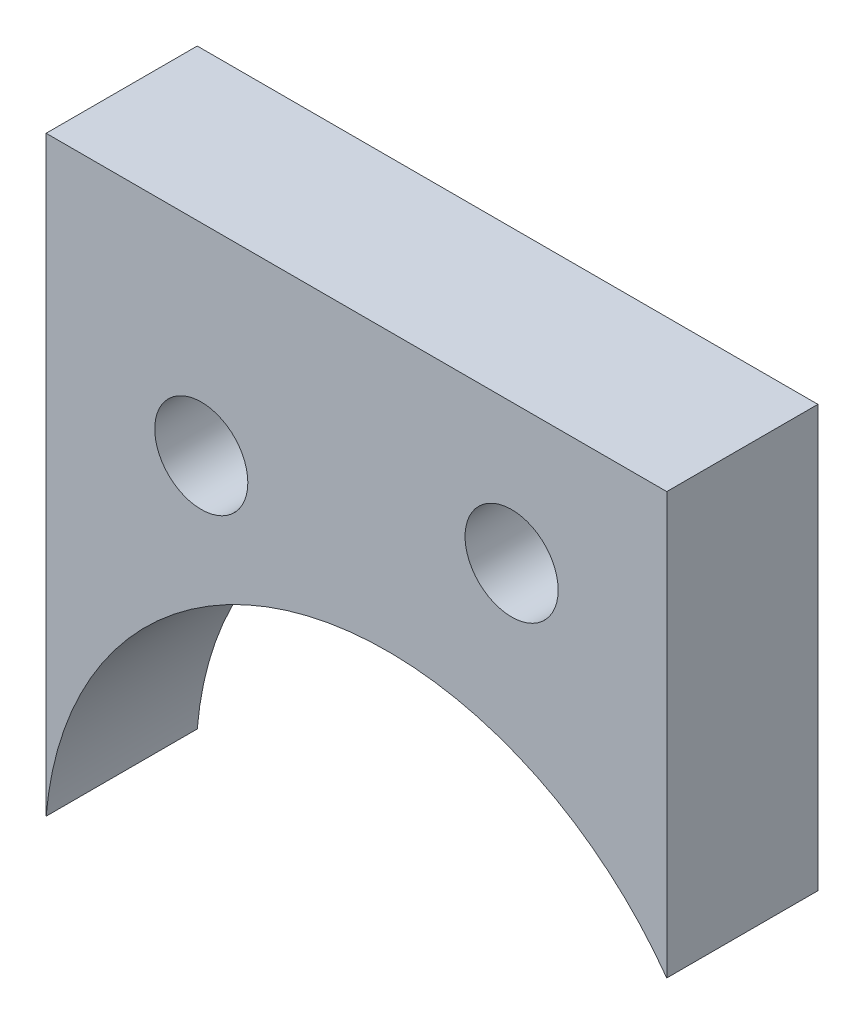
ISO-10303-21;
HEADER;
FILE_DESCRIPTION(('STEP AP214'),'2;1');
FILE_NAME('part.step','',(''),(''),'','','');
FILE_SCHEMA(('AUTOMOTIVE_DESIGN { 1 0 10303 214 1 1 1 1 }'));
ENDSEC;
DATA;
#1=APPLICATION_CONTEXT('core data for automotive mechanical design processes');
#2=APPLICATION_PROTOCOL_DEFINITION('international standard','automotive_design',2000,#1);
#3=PRODUCT_CONTEXT('',#1,'mechanical');
#4=PRODUCT('Part','Part','',(#3));
#5=PRODUCT_RELATED_PRODUCT_CATEGORY('part','',(#4));
#6=PRODUCT_DEFINITION_FORMATION('','',#4);
#7=PRODUCT_DEFINITION_CONTEXT('part definition',#1,'design');
#8=PRODUCT_DEFINITION('design','',#6,#7);
#9=PRODUCT_DEFINITION_SHAPE('','',#8);
#10=(LENGTH_UNIT() NAMED_UNIT(*) SI_UNIT(.MILLI.,.METRE.));
#11=(NAMED_UNIT(*) PLANE_ANGLE_UNIT() SI_UNIT($,.RADIAN.));
#12=(NAMED_UNIT(*) SI_UNIT($,.STERADIAN.) SOLID_ANGLE_UNIT());
#13=UNCERTAINTY_MEASURE_WITH_UNIT(LENGTH_MEASURE(1.E-05),#10,'distance_accuracy_value','');
#14=(GEOMETRIC_REPRESENTATION_CONTEXT(3) GLOBAL_UNCERTAINTY_ASSIGNED_CONTEXT((#13)) GLOBAL_UNIT_ASSIGNED_CONTEXT((#10,
#11,#12)) REPRESENTATION_CONTEXT('',''));
#15=CARTESIAN_POINT('',(0.,0.,0.));
#16=DIRECTION('',(0.,0.,1.));
#17=DIRECTION('',(1.,0.,0.));
#18=AXIS2_PLACEMENT_3D('',#15,#16,#17);
#19=CARTESIAN_POINT('',(11.01,0.,4.87));
#20=DIRECTION('',(0.,0.,1.));
#21=DIRECTION('',(1.,0.,0.));
#22=AXIS2_PLACEMENT_3D('',#19,#20,#21);
#23=PLANE('',#22);
#24=CARTESIAN_POINT('',(5.,13.5,4.87));
#25=DIRECTION('',(0.,0.,1.));
#26=DIRECTION('',(1.,0.,0.));
#27=AXIS2_PLACEMENT_3D('',#24,#25,#26);
#28=CIRCLE('',#27,1.5);
#29=CARTESIAN_POINT('',(6.5,13.5,4.87));
#30=VERTEX_POINT('',#29);
#31=EDGE_CURVE('E116',#30,#30,#28,.T.);
#32=ORIENTED_EDGE('',*,*,#31,.F.);
#33=EDGE_LOOP('',(#32));
#34=FACE_BOUND('',#33,.T.);
#35=DIRECTION('',(0.,1.,0.));
#36=VECTOR('',#35,1.);
#37=CARTESIAN_POINT('',(20.,6.42513813081089,4.87));
#38=LINE('',#37,#36);
#39=CARTESIAN_POINT('',(20.,6.42513813081089,4.87));
#40=VERTEX_POINT('',#39);
#41=CARTESIAN_POINT('',(20.,20.,4.87));
#42=VERTEX_POINT('',#41);
#43=EDGE_CURVE('E96',#40,#42,#38,.T.);
#44=ORIENTED_EDGE('',*,*,#43,.T.);
#45=DIRECTION('',(-1.,0.,0.));
#46=VECTOR('',#45,1.);
#47=CARTESIAN_POINT('',(0.,20.,4.87));
#48=LINE('',#47,#46);
#49=CARTESIAN_POINT('',(0.,20.,4.87));
#50=VERTEX_POINT('',#49);
#51=EDGE_CURVE('E91',#42,#50,#48,.T.);
#52=ORIENTED_EDGE('',*,*,#51,.T.);
#53=DIRECTION('',(0.,-1.,0.));
#54=VECTOR('',#53,1.);
#55=CARTESIAN_POINT('',(0.,0.939361485265461,4.87));
#56=LINE('',#55,#54);
#57=CARTESIAN_POINT('',(0.,0.939361485265461,4.87));
#58=VERTEX_POINT('',#57);
#59=EDGE_CURVE('E94',#50,#58,#56,.T.);
#60=ORIENTED_EDGE('',*,*,#59,.T.);
#61=CARTESIAN_POINT('',(11.01,0.,4.87));
#62=DIRECTION('',(0.,0.,-1.));
#63=DIRECTION('',(1.,0.,0.));
#64=AXIS2_PLACEMENT_3D('',#61,#62,#63);
#65=CIRCLE('',#64,11.05);
#66=EDGE_CURVE('E61',#58,#40,#65,.T.);
#67=ORIENTED_EDGE('',*,*,#66,.T.);
#68=EDGE_LOOP('',(#44,#52,#60,#67));
#69=FACE_BOUND('',#68,.T.);
#70=CARTESIAN_POINT('',(15.,15.5,4.87));
#71=DIRECTION('',(0.,0.,1.));
#72=DIRECTION('',(1.,0.,0.));
#73=AXIS2_PLACEMENT_3D('',#70,#71,#72);
#74=CIRCLE('',#73,1.5);
#75=CARTESIAN_POINT('',(16.5,15.5,4.87));
#76=VERTEX_POINT('',#75);
#77=EDGE_CURVE('E138',#76,#76,#74,.T.);
#78=ORIENTED_EDGE('',*,*,#77,.F.);
#79=EDGE_LOOP('',(#78));
#80=FACE_BOUND('',#79,.T.);
#81=ADVANCED_FACE('F43',(#34,#69,#80),#23,.T.);
#82=CARTESIAN_POINT('',(11.01,0.,0.));
#83=DIRECTION('',(0.,0.,1.));
#84=DIRECTION('',(1.,0.,0.));
#85=AXIS2_PLACEMENT_3D('',#82,#83,#84);
#86=PLANE('',#85);
#87=DIRECTION('',(0.,1.,0.));
#88=VECTOR('',#87,1.);
#89=CARTESIAN_POINT('',(20.,6.42513813081089,0.));
#90=LINE('',#89,#88);
#91=CARTESIAN_POINT('',(20.,6.42513813081089,0.));
#92=VERTEX_POINT('',#91);
#93=CARTESIAN_POINT('',(20.,20.,0.));
#94=VERTEX_POINT('',#93);
#95=EDGE_CURVE('E112',#92,#94,#90,.T.);
#96=ORIENTED_EDGE('',*,*,#95,.F.);
#97=CARTESIAN_POINT('',(11.01,0.,0.));
#98=DIRECTION('',(0.,0.,-1.));
#99=DIRECTION('',(1.,0.,0.));
#100=AXIS2_PLACEMENT_3D('',#97,#98,#99);
#101=CIRCLE('',#100,11.05);
#102=CARTESIAN_POINT('',(0.,0.939361485265461,0.));
#103=VERTEX_POINT('',#102);
#104=EDGE_CURVE('E84',#103,#92,#101,.T.);
#105=ORIENTED_EDGE('',*,*,#104,.F.);
#106=DIRECTION('',(0.,-1.,0.));
#107=VECTOR('',#106,1.);
#108=CARTESIAN_POINT('',(0.,0.939361485265461,0.));
#109=LINE('',#108,#107);
#110=CARTESIAN_POINT('',(0.,20.,0.));
#111=VERTEX_POINT('',#110);
#112=EDGE_CURVE('E78',#111,#103,#109,.T.);
#113=ORIENTED_EDGE('',*,*,#112,.F.);
#114=DIRECTION('',(-1.,0.,0.));
#115=VECTOR('',#114,1.);
#116=CARTESIAN_POINT('',(0.,20.,0.));
#117=LINE('',#116,#115);
#118=EDGE_CURVE('E101',#94,#111,#117,.T.);
#119=ORIENTED_EDGE('',*,*,#118,.F.);
#120=EDGE_LOOP('',(#96,#105,#113,#119));
#121=FACE_BOUND('',#120,.T.);
#122=CARTESIAN_POINT('',(5.,13.5,0.));
#123=DIRECTION('',(0.,0.,1.));
#124=DIRECTION('',(1.,0.,0.));
#125=AXIS2_PLACEMENT_3D('',#122,#123,#124);
#126=CIRCLE('',#125,1.5);
#127=CARTESIAN_POINT('',(6.5,13.5,0.));
#128=VERTEX_POINT('',#127);
#129=EDGE_CURVE('E134',#128,#128,#126,.T.);
#130=ORIENTED_EDGE('',*,*,#129,.T.);
#131=EDGE_LOOP('',(#130));
#132=FACE_BOUND('',#131,.T.);
#133=CARTESIAN_POINT('',(15.,15.5,0.));
#134=DIRECTION('',(0.,0.,1.));
#135=DIRECTION('',(1.,0.,0.));
#136=AXIS2_PLACEMENT_3D('',#133,#134,#135);
#137=CIRCLE('',#136,1.5);
#138=CARTESIAN_POINT('',(16.5,15.5,0.));
#139=VERTEX_POINT('',#138);
#140=EDGE_CURVE('E142',#139,#139,#137,.T.);
#141=ORIENTED_EDGE('',*,*,#140,.T.);
#142=EDGE_LOOP('',(#141));
#143=FACE_BOUND('',#142,.T.);
#144=ADVANCED_FACE('F129',(#121,#132,#143),#86,.F.);
#145=CARTESIAN_POINT('',(20.,6.42513813081089,4.87));
#146=DIRECTION('',(-1.,0.,0.));
#147=DIRECTION('',(0.,0.,1.));
#148=AXIS2_PLACEMENT_3D('',#145,#146,#147);
#149=PLANE('',#148);
#150=ORIENTED_EDGE('',*,*,#95,.T.);
#151=DIRECTION('',(0.,0.,-1.));
#152=VECTOR('',#151,1.);
#153=CARTESIAN_POINT('',(20.,20.,4.87));
#154=LINE('',#153,#152);
#155=EDGE_CURVE('E11',#42,#94,#154,.T.);
#156=ORIENTED_EDGE('',*,*,#155,.F.);
#157=ORIENTED_EDGE('',*,*,#43,.F.);
#158=DIRECTION('',(0.,0.,-1.));
#159=VECTOR('',#158,1.);
#160=CARTESIAN_POINT('',(20.,6.42513813081089,4.87));
#161=LINE('',#160,#159);
#162=EDGE_CURVE('E108',#40,#92,#161,.T.);
#163=ORIENTED_EDGE('',*,*,#162,.T.);
#164=EDGE_LOOP('',(#150,#156,#157,#163));
#165=FACE_BOUND('',#164,.T.);
#166=ADVANCED_FACE('F45',(#165),#149,.F.);
#167=CARTESIAN_POINT('',(0.,20.,4.87));
#168=DIRECTION('',(0.,-1.,0.));
#169=DIRECTION('',(0.,0.,-1.));
#170=AXIS2_PLACEMENT_3D('',#167,#168,#169);
#171=PLANE('',#170);
#172=ORIENTED_EDGE('',*,*,#118,.T.);
#173=DIRECTION('',(0.,0.,-1.));
#174=VECTOR('',#173,1.);
#175=CARTESIAN_POINT('',(0.,20.,4.87));
#176=LINE('',#175,#174);
#177=EDGE_CURVE('E53',#50,#111,#176,.T.);
#178=ORIENTED_EDGE('',*,*,#177,.F.);
#179=ORIENTED_EDGE('',*,*,#51,.F.);
#180=ORIENTED_EDGE('',*,*,#155,.T.);
#181=EDGE_LOOP('',(#172,#178,#179,#180));
#182=FACE_BOUND('',#181,.T.);
#183=ADVANCED_FACE('F100',(#182),#171,.F.);
#184=CARTESIAN_POINT('',(0.,0.939361485265461,4.87));
#185=DIRECTION('',(1.,0.,0.));
#186=DIRECTION('',(0.,0.,-1.));
#187=AXIS2_PLACEMENT_3D('',#184,#185,#186);
#188=PLANE('',#187);
#189=ORIENTED_EDGE('',*,*,#112,.T.);
#190=DIRECTION('',(0.,0.,-1.));
#191=VECTOR('',#190,1.);
#192=CARTESIAN_POINT('',(0.,0.939361485265461,4.87));
#193=LINE('',#192,#191);
#194=EDGE_CURVE('E103',#58,#103,#193,.T.);
#195=ORIENTED_EDGE('',*,*,#194,.F.);
#196=ORIENTED_EDGE('',*,*,#59,.F.);
#197=ORIENTED_EDGE('',*,*,#177,.T.);
#198=EDGE_LOOP('',(#189,#195,#196,#197));
#199=FACE_BOUND('',#198,.T.);
#200=ADVANCED_FACE('F104',(#199),#188,.F.);
#201=CARTESIAN_POINT('',(11.01,0.,4.87));
#202=DIRECTION('',(0.,0.,-1.));
#203=DIRECTION('',(-1.,0.,0.));
#204=AXIS2_PLACEMENT_3D('',#201,#202,#203);
#205=CYLINDRICAL_SURFACE('',#204,11.05);
#206=ORIENTED_EDGE('',*,*,#104,.T.);
#207=ORIENTED_EDGE('',*,*,#162,.F.);
#208=ORIENTED_EDGE('',*,*,#66,.F.);
#209=ORIENTED_EDGE('',*,*,#194,.T.);
#210=EDGE_LOOP('',(#206,#207,#208,#209));
#211=FACE_BOUND('',#210,.T.);
#212=ADVANCED_FACE('F126',(#211),#205,.F.);
#213=CARTESIAN_POINT('',(5.,13.5,4.87));
#214=DIRECTION('',(0.,0.,-1.));
#215=DIRECTION('',(-1.,0.,0.));
#216=AXIS2_PLACEMENT_3D('',#213,#214,#215);
#217=CYLINDRICAL_SURFACE('',#216,1.5);
#218=ORIENTED_EDGE('',*,*,#31,.T.);
#219=EDGE_LOOP('',(#218));
#220=FACE_BOUND('',#219,.T.);
#221=ORIENTED_EDGE('',*,*,#129,.F.);
#222=EDGE_LOOP('',(#221));
#223=FACE_BOUND('',#222,.T.);
#224=ADVANCED_FACE('F161',(#220,#223),#217,.F.);
#225=CARTESIAN_POINT('',(15.,15.5,4.87));
#226=DIRECTION('',(0.,0.,-1.));
#227=DIRECTION('',(-1.,0.,0.));
#228=AXIS2_PLACEMENT_3D('',#225,#226,#227);
#229=CYLINDRICAL_SURFACE('',#228,1.5);
#230=ORIENTED_EDGE('',*,*,#77,.T.);
#231=EDGE_LOOP('',(#230));
#232=FACE_BOUND('',#231,.T.);
#233=ORIENTED_EDGE('',*,*,#140,.F.);
#234=EDGE_LOOP('',(#233));
#235=FACE_BOUND('',#234,.T.);
#236=ADVANCED_FACE('F150',(#232,#235),#229,.F.);
#237=CLOSED_SHELL('',(#81,#144,#166,#183,#200,#212,#224,#236));
#238=MANIFOLD_SOLID_BREP('B2',#237);
#239=ADVANCED_BREP_SHAPE_REPRESENTATION('',(#18,#238),#14);
#240=SHAPE_DEFINITION_REPRESENTATION(#9,#239);
ENDSEC;
END-ISO-10303-21;
